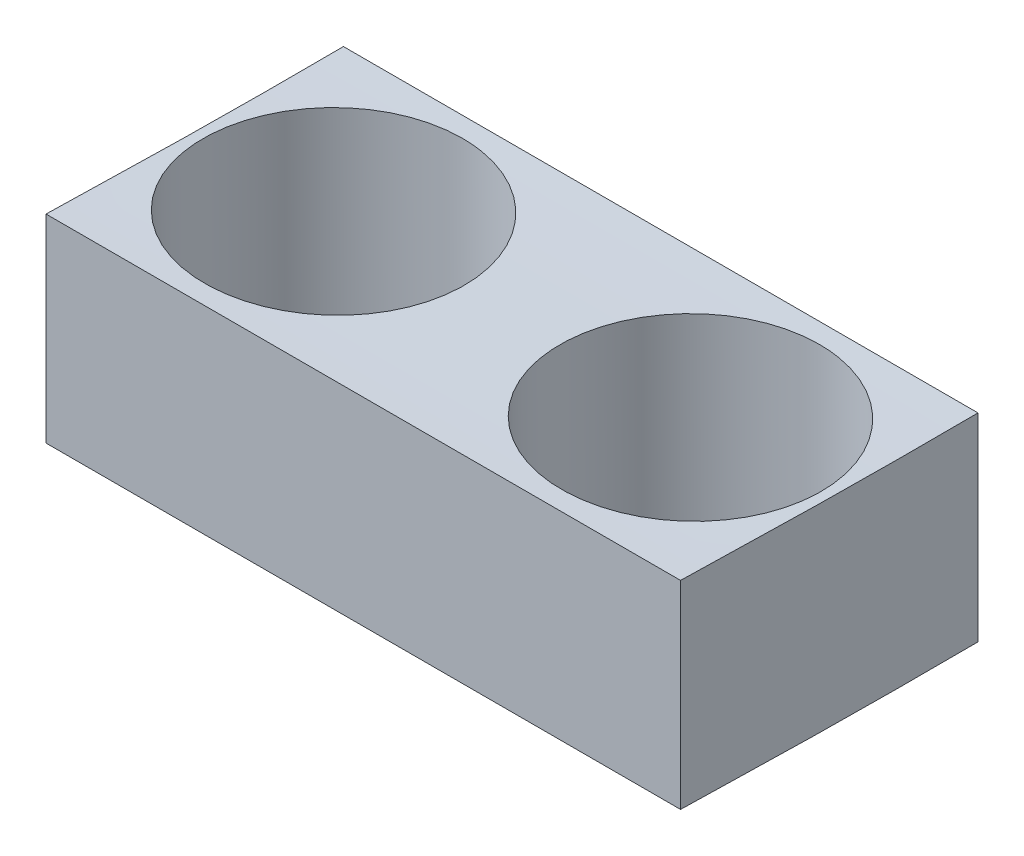
ISO-10303-21;
HEADER;
FILE_DESCRIPTION(('STEP AP214'),'2;1');
FILE_NAME('part.step','',(''),(''),'','','');
FILE_SCHEMA(('AUTOMOTIVE_DESIGN { 1 0 10303 214 1 1 1 1 }'));
ENDSEC;
DATA;
#1=APPLICATION_CONTEXT('core data for automotive mechanical design processes');
#2=APPLICATION_PROTOCOL_DEFINITION('international standard','automotive_design',2000,#1);
#3=PRODUCT_CONTEXT('',#1,'mechanical');
#4=PRODUCT('Part','Part','',(#3));
#5=PRODUCT_RELATED_PRODUCT_CATEGORY('part','',(#4));
#6=PRODUCT_DEFINITION_FORMATION('','',#4);
#7=PRODUCT_DEFINITION_CONTEXT('part definition',#1,'design');
#8=PRODUCT_DEFINITION('design','',#6,#7);
#9=PRODUCT_DEFINITION_SHAPE('','',#8);
#10=(LENGTH_UNIT() NAMED_UNIT(*) SI_UNIT(.MILLI.,.METRE.));
#11=(NAMED_UNIT(*) PLANE_ANGLE_UNIT() SI_UNIT($,.RADIAN.));
#12=(NAMED_UNIT(*) SI_UNIT($,.STERADIAN.) SOLID_ANGLE_UNIT());
#13=UNCERTAINTY_MEASURE_WITH_UNIT(LENGTH_MEASURE(1.E-05),#10,'distance_accuracy_value','');
#14=(GEOMETRIC_REPRESENTATION_CONTEXT(3) GLOBAL_UNCERTAINTY_ASSIGNED_CONTEXT((#13)) GLOBAL_UNIT_ASSIGNED_CONTEXT((#10,
#11,#12)) REPRESENTATION_CONTEXT('',''));
#15=CARTESIAN_POINT('',(0.,0.,0.));
#16=DIRECTION('',(0.,0.,1.));
#17=DIRECTION('',(1.,0.,0.));
#18=AXIS2_PLACEMENT_3D('',#15,#16,#17);
#19=CARTESIAN_POINT('',(-40.,-39.376697628539,0.));
#20=CARTESIAN_POINT('',(-40.,-37.8138326416831,-18.6089310298579));
#21=CARTESIAN_POINT('',(-40.,-41.4487875194083,-60.5220187074735));
#22=CARTESIAN_POINT('',(-40.,-41.8150395607881,-82.6293162514277));
#23=CARTESIAN_POINT('',(-40.,-29.981594576715,-94.4769548986795));
#24=CARTESIAN_POINT('',(-40.,-11.4071796829403,-72.3520517103376));
#25=CARTESIAN_POINT('',(-40.,50.0000000000028,-96.0000000000011));
#26=B_SPLINE_CURVE_WITH_KNOTS('',3,(#19,#20,#21,#22,#23,#24,#25),.UNSPECIFIED.,.F.,.F.,(4,1,1,1,
4),(0.,0.361871867439847,0.526261734758969,0.755385014590914,1.),.UNSPECIFIED.);
#27=DIRECTION('',(1.,0.,0.));
#28=VECTOR('',#27,1.);
#29=SURFACE_OF_LINEAR_EXTRUSION('',#26,#28);
#30=OFFSET_SURFACE('',#29,2.,.F.);
#31=CARTESIAN_POINT('',(-8.2,-43.4846554974634,-71.6682456572165));
#32=CARTESIAN_POINT('',(-8.27303112387663,-43.4846556502531,-71.6682406465253));
#33=CARTESIAN_POINT('',(-8.34613831165488,-43.4846864136896,-71.6620626131756));
#34=CARTESIAN_POINT('',(-8.45417123849626,-43.4847699746228,-71.6436833802276));
#35=CARTESIAN_POINT('',(-8.4899396909148,-43.4848041078006,-71.6360282026123));
#36=CARTESIAN_POINT('',(-8.56074039152526,-43.4848811254592,-71.6177274385375));
#37=CARTESIAN_POINT('',(-8.5957719614552,-43.4849240176441,-71.6070792163785));
#38=CARTESIAN_POINT('',(-8.69924031339842,-43.4850592391006,-71.5707810972745));
#39=CARTESIAN_POINT('',(-8.76619239579917,-43.4851582536088,-71.5407534923485));
#40=CARTESIAN_POINT('',(-8.89409790578115,-43.4853265089781,-71.4698700296098));
#41=CARTESIAN_POINT('',(-8.95505121898232,-43.4853957492716,-71.4290139653829));
#42=CARTESIAN_POINT('',(-9.04066005857345,-43.4854354910246,-71.3605322294756));
#43=CARTESIAN_POINT('',(-9.06824247509395,-43.4854380322336,-71.3364870738783));
#44=CARTESIAN_POINT('',(-9.12125984129126,-43.4854148245407,-71.286185573025));
#45=CARTESIAN_POINT('',(-9.1466968292553,-43.485389102824,-71.2599313749764));
#46=CARTESIAN_POINT('',(-9.21956444353279,-43.4852592764635,-71.1780679514658));
#47=CARTESIAN_POINT('',(-9.26357308119811,-43.4851025305622,-71.119340774761));
#48=CARTESIAN_POINT('',(-9.34107886669575,-43.4846034285649,-70.9953667087432));
#49=CARTESIAN_POINT('',(-9.37457682115559,-43.4842610867176,-70.930120320245));
#50=CARTESIAN_POINT('',(-9.43015086783799,-43.4833624100307,-70.7949237200832));
#51=CARTESIAN_POINT('',(-9.45222698557537,-43.482806075669,-70.7249735189279));
#52=CARTESIAN_POINT('',(-9.48432281901926,-43.4814725938492,-70.582363556741));
#53=CARTESIAN_POINT('',(-9.49434242142594,-43.480695444316,-70.5097037702531));
#54=CARTESIAN_POINT('',(-9.50204472978763,-43.4789369874492,-70.3637352808305));
#55=CARTESIAN_POINT('',(-9.49972744336393,-43.4779556802418,-70.2904265782967));
#56=CARTESIAN_POINT('',(-9.48282106159425,-43.4758278089597,-70.1452261217602));
#57=CARTESIAN_POINT('',(-9.46822954783514,-43.4746812123546,-70.0733346498541));
#58=CARTESIAN_POINT('',(-9.42718687478221,-43.4722810136944,-69.9330224565727));
#59=CARTESIAN_POINT('',(-9.40073568102471,-43.4710274113283,-69.864601745284));
#60=CARTESIAN_POINT('',(-9.33671579204778,-43.4684846033379,-69.7331542846599));
#61=CARTESIAN_POINT('',(-9.29914418772997,-43.4671953884776,-69.6701289523241));
#62=CARTESIAN_POINT('',(-9.213951685453,-43.4646606462488,-69.551280808086));
#63=CARTESIAN_POINT('',(-9.16633078607163,-43.4634151188866,-69.495457997203));
#64=CARTESIAN_POINT('',(-9.06238857222688,-43.4610470593677,-69.3925984993422));
#65=CARTESIAN_POINT('',(-9.00606701898153,-43.4599245305881,-69.345562053577));
#66=CARTESIAN_POINT('',(-8.88632222060555,-43.4578756643075,-69.2616142461664));
#67=CARTESIAN_POINT('',(-8.82289898662817,-43.4569493264984,-69.2247028686199));
#68=CARTESIAN_POINT('',(-8.69077246263277,-43.4553542578008,-69.1620656056666));
#69=CARTESIAN_POINT('',(-8.62207086392351,-43.454685444805,-69.1363361547596));
#70=CARTESIAN_POINT('',(-8.48132068497089,-43.4536494580269,-69.0967782589318));
#71=CARTESIAN_POINT('',(-8.40927211374067,-43.4532822834323,-69.0829497819645));
#72=CARTESIAN_POINT('',(-8.26390554334303,-43.4528741476542,-69.0675910489207));
#73=CARTESIAN_POINT('',(-8.19058808822901,-43.4528330499708,-69.066055646806));
#74=CARTESIAN_POINT('',(-8.04473632449364,-43.4530794501121,-69.0753132409209));
#75=CARTESIAN_POINT('',(-7.97220201492549,-43.4533669475395,-69.0861062222438));
#76=CARTESIAN_POINT('',(-7.82998629639846,-43.4542513018657,-69.1197107215228));
#77=CARTESIAN_POINT('',(-7.76030447360821,-43.4548481137171,-69.1425204894075));
#78=CARTESIAN_POINT('',(-7.62575911218361,-43.4563114033955,-69.1995085733103));
#79=CARTESIAN_POINT('',(-7.56089557900296,-43.4571778815278,-69.2336869021961));
#80=CARTESIAN_POINT('',(-7.43780935829287,-43.4591235204157,-69.3124511230809));
#81=CARTESIAN_POINT('',(-7.37958839953484,-43.4602027363392,-69.3570397152596));
#82=CARTESIAN_POINT('',(-7.27145648753467,-43.4625031851663,-69.455353504246));
#83=CARTESIAN_POINT('',(-7.22154555913485,-43.4637244184944,-69.5090787283662));
#84=CARTESIAN_POINT('',(-7.13142809183294,-43.4662312014234,-69.6241665949467));
#85=CARTESIAN_POINT('',(-7.0912257322794,-43.4675167784366,-69.6855325094079));
#86=CARTESIAN_POINT('',(-7.02169289629293,-43.4700720950948,-69.8141424669916));
#87=CARTESIAN_POINT('',(-6.99236242509711,-43.4713418347322,-69.8813865129456));
#88=CARTESIAN_POINT('',(-6.94540042443464,-43.4737915594479,-70.0198613062948));
#89=CARTESIAN_POINT('',(-6.9277715166692,-43.47497152436,-70.0910929432243));
#90=CARTESIAN_POINT('',(-6.90472413040742,-43.4771792317987,-70.2355068463306));
#91=CARTESIAN_POINT('',(-6.8993056660949,-43.4782069741485,-70.3086891147732));
#92=CARTESIAN_POINT('',(-6.90083655724749,-43.4800657691059,-70.4549197416699));
#93=CARTESIAN_POINT('',(-6.90778432918013,-43.4808968468814,-70.5279681160704));
#94=CARTESIAN_POINT('',(-6.93384168207776,-43.4823399621694,-70.671854992747));
#95=CARTESIAN_POINT('',(-6.95295126815988,-43.4829519995897,-70.7426934940932));
#96=CARTESIAN_POINT('',(-7.00281204031894,-43.4839579803342,-70.8801702568316));
#97=CARTESIAN_POINT('',(-7.03356028090579,-43.4843519787774,-70.9468095759722));
#98=CARTESIAN_POINT('',(-7.08768952288126,-43.4847969731603,-71.0421132547074));
#99=CARTESIAN_POINT('',(-7.10707139683355,-43.4849209801371,-71.0731105510409));
#100=CARTESIAN_POINT('',(-7.14839318576957,-43.4851255889827,-71.1333954673348));
#101=CARTESIAN_POINT('',(-7.17033554331159,-43.4852061489869,-71.1626814141392));
#102=CARTESIAN_POINT('',(-7.23971878531149,-43.4853903689154,-71.2475562030343));
#103=CARTESIAN_POINT('',(-7.29076996271752,-43.4854369757807,-71.3002570646243));
#104=CARTESIAN_POINT('',(-7.40100292878272,-43.4854303340653,-71.3963265721173));
#105=CARTESIAN_POINT('',(-7.46018456201403,-43.4853770873931,-71.4396953963779));
#106=CARTESIAN_POINT('',(-7.55375968909839,-43.4852646816273,-71.4968368746868));
#107=CARTESIAN_POINT('',(-7.58578573171794,-43.4852217320766,-71.5145789586019));
#108=CARTESIAN_POINT('',(-7.65118578223092,-43.4851314660106,-71.5472883616101));
#109=CARTESIAN_POINT('',(-7.68455857560411,-43.4850841533827,-71.5622581156133));
#110=CARTESIAN_POINT('',(-7.78634799483633,-43.4849450074464,-71.6028352841677));
#111=CARTESIAN_POINT('',(-7.85653979746781,-43.4848558014372,-71.6241740683759));
#112=CARTESIAN_POINT('',(-7.97263554016092,-43.4847463283771,-71.6490276501623));
#113=CARTESIAN_POINT('',(-8.01779885422297,-43.4847127554587,-71.6562242389168));
#114=CARTESIAN_POINT('',(-8.10863151761496,-43.4846672921975,-71.6658348102358));
#115=CARTESIAN_POINT('',(-8.15430086696079,-43.4846554018555,-71.6682487926502));
#116=CARTESIAN_POINT('',(-8.2,-43.4846554974634,-71.6682456572165));
#117=B_SPLINE_CURVE_WITH_KNOTS('',3,(#31,#32,#33,#34,#35,#36,#37,#38,#39,#40,#41,#42,#43,#44,
#45,#46,#47,#48,#49,#50,#51,#52,#53,#54,#55,#56,#57,#58,#59,#60,#61,#62,#63,#64,#65,#66,#67,#68,
#69,#70,#71,#72,#73,#74,#75,#76,#77,#78,#79,#80,#81,#82,#83,#84,#85,#86,#87,#88,#89,#90,#91,#92,
#93,#94,#95,#96,#97,#98,#99,#100,#101,#102,#103,#104,#105,#106,#107,#108,#109,#110,#111,#112,
#113,#114,#115,#116),.UNSPECIFIED.,.T.,.F.,(4,2,2,2,2,2,2,2,2,2,2,2,2,2,2,2,2,2,2,2,2,2,2,2,2,2,
2,2,2,2,2,2,2,2,2,2,2,2,2,2,2,2,4),(0.,0.218897818099868,0.328527456001121,0.438253938754205,
0.657281307682837,0.87631285205387,0.985973888539678,1.09552953843753,1.314559753963,
1.5335731562109,1.75258606921073,1.97160104034496,2.1906158761793,2.40967387501167,
2.62873251042021,2.84784850227327,3.06696452513645,3.28608656251963,3.50520825577489,
3.72426002792299,3.94331121021521,4.16227069009069,4.38122990521792,4.60015724090989,
4.81908482439705,5.03806925580531,5.25705434184197,5.47613352929091,5.69521282227271,
5.91434118277945,6.13346979782855,6.35257035484081,6.57167100404073,6.79071624066963,
6.90027927623439,7.00994769664631,7.22896056346426,7.44796924405161,7.55768973734911,
7.66731340240548,7.88619937382433,8.02317440127386,8.16014943301839),.UNSPECIFIED.);
#118=CARTESIAN_POINT('',(-8.2,-43.4846554974634,-71.6682456572165));
#119=VERTEX_POINT('',#118);
#120=EDGE_CURVE('E172',#119,#119,#117,.T.);
#121=ORIENTED_EDGE('',*,*,#120,.T.);
#122=EDGE_LOOP('',(#121));
#123=FACE_BOUND('',#122,.T.);
#124=DIRECTION('',(1.,0.,0.));
#125=VECTOR('',#124,1.);
#126=CARTESIAN_POINT('',(0.,-43.4834502732561,-71.8589316958776));
#127=LINE('',#126,#125);
#128=CARTESIAN_POINT('',(-6.8,-43.4834502732561,-71.8589316958776));
#129=VERTEX_POINT('',#128);
#130=CARTESIAN_POINT('',(-13.2,-43.4834502732561,-71.8589316958776));
#131=VERTEX_POINT('',#130);
#132=EDGE_CURVE('E12',#129,#131,#127,.F.);
#133=ORIENTED_EDGE('',*,*,#132,.F.);
#134=CARTESIAN_POINT('',(-6.8,-43.4471154849081,-68.8589316958776));
#135=CARTESIAN_POINT('',(-6.8,-43.4518691412671,-69.0255607476172));
#136=CARTESIAN_POINT('',(-6.8,-43.4562562444957,-69.1922007044846));
#137=CARTESIAN_POINT('',(-6.8,-43.4642114739682,-69.5254888623006));
#138=CARTESIAN_POINT('',(-6.8,-43.4677796553685,-69.6921370619374));
#139=CARTESIAN_POINT('',(-6.8,-43.4740117074276,-70.0254438197788));
#140=CARTESIAN_POINT('',(-6.8,-43.4766756148282,-70.1921023772872));
#141=CARTESIAN_POINT('',(-6.8,-43.4810050897368,-70.5254341787751));
#142=CARTESIAN_POINT('',(-6.8,-43.4826706478442,-70.6921074228781));
#143=CARTESIAN_POINT('',(-6.8,-43.4849030154317,-71.0254668183174));
#144=CARTESIAN_POINT('',(-6.8,-43.4854697905965,-71.1921529698944));
#145=CARTESIAN_POINT('',(-6.8,-43.4853944042354,-71.5255380658306));
#146=CARTESIAN_POINT('',(-6.8,-43.4847521469752,-71.6922370101577));
#147=CARTESIAN_POINT('',(-6.8,-43.4834502732561,-71.8589316958777));
#148=B_SPLINE_CURVE_WITH_KNOTS('',3,(#134,#135,#136,#137,#138,#139,#140,#141,#142,#143,#144,
#145,#146,#147),.UNSPECIFIED.,.F.,.F.,(4,2,2,2,2,2,4),(0.,0.500090794916213,1.00014789763484,
1.50018467996219,2.00022617069861,2.50028327768226,3.00037998218205),.UNSPECIFIED.);
#149=CARTESIAN_POINT('',(-6.8,-43.4471154849081,-68.8589316958776));
#150=VERTEX_POINT('',#149);
#151=EDGE_CURVE('E106',#150,#129,#148,.T.);
#152=ORIENTED_EDGE('',*,*,#151,.F.);
#153=DIRECTION('',(1.,0.,0.));
#154=VECTOR('',#153,1.);
#155=CARTESIAN_POINT('',(0.,-43.4471154849081,-68.8589316958777));
#156=LINE('',#155,#154);
#157=CARTESIAN_POINT('',(-13.2,-43.4471154849081,-68.8589316958776));
#158=VERTEX_POINT('',#157);
#159=EDGE_CURVE('E111',#150,#158,#156,.F.);
#160=ORIENTED_EDGE('',*,*,#159,.T.);
#161=CARTESIAN_POINT('',(-13.2,-43.4471154849081,-68.8589316958776));
#162=CARTESIAN_POINT('',(-13.2,-43.4518691412671,-69.0255607476172));
#163=CARTESIAN_POINT('',(-13.2,-43.4562562444957,-69.1922007044846));
#164=CARTESIAN_POINT('',(-13.2,-43.4642114739682,-69.5254888623006));
#165=CARTESIAN_POINT('',(-13.2,-43.4677796553685,-69.6921370619374));
#166=CARTESIAN_POINT('',(-13.2,-43.4740117074276,-70.0254438197788));
#167=CARTESIAN_POINT('',(-13.2,-43.4766756148282,-70.1921023772872));
#168=CARTESIAN_POINT('',(-13.2,-43.4810050897368,-70.5254341787751));
#169=CARTESIAN_POINT('',(-13.2,-43.4826706478442,-70.6921074228781));
#170=CARTESIAN_POINT('',(-13.2,-43.4849030154317,-71.0254668183174));
#171=CARTESIAN_POINT('',(-13.2,-43.4854697905965,-71.1921529698944));
#172=CARTESIAN_POINT('',(-13.2,-43.4853944042354,-71.5255380658306));
#173=CARTESIAN_POINT('',(-13.2,-43.4847521469752,-71.6922370101577));
#174=CARTESIAN_POINT('',(-13.2,-43.4834502732561,-71.8589316958777));
#175=B_SPLINE_CURVE_WITH_KNOTS('',3,(#161,#162,#163,#164,#165,#166,#167,#168,#169,#170,#171,
#172,#173,#174),.UNSPECIFIED.,.F.,.F.,(4,2,2,2,2,2,4),(0.,0.500090794916213,1.00014789763484,
1.50018467996219,2.00022617069861,2.50028327768226,3.00037998218205),.UNSPECIFIED.);
#176=EDGE_CURVE('E76',#158,#131,#175,.T.);
#177=ORIENTED_EDGE('',*,*,#176,.T.);
#178=EDGE_LOOP('',(#133,#152,#160,#177));
#179=FACE_BOUND('',#178,.T.);
#180=CARTESIAN_POINT('',(-11.8,-43.4846554974634,-71.6682456572165));
#181=CARTESIAN_POINT('',(-11.8730311238766,-43.4846556502531,-71.6682406465253));
#182=CARTESIAN_POINT('',(-11.9461383116549,-43.4846864136896,-71.6620626131756));
#183=CARTESIAN_POINT('',(-12.0541712384963,-43.4847699746228,-71.6436833802276));
#184=CARTESIAN_POINT('',(-12.0899396909148,-43.4848041078006,-71.6360282026123));
#185=CARTESIAN_POINT('',(-12.1607403915253,-43.4848811254592,-71.6177274385376));
#186=CARTESIAN_POINT('',(-12.1957719614552,-43.4849240176441,-71.6070792163785));
#187=CARTESIAN_POINT('',(-12.2992403133984,-43.4850592391006,-71.5707810972745));
#188=CARTESIAN_POINT('',(-12.3661923957992,-43.4851582536088,-71.5407534923485));
#189=CARTESIAN_POINT('',(-12.4940979057812,-43.4853265089781,-71.4698700296099));
#190=CARTESIAN_POINT('',(-12.5550512189823,-43.4853957492716,-71.429013965383));
#191=CARTESIAN_POINT('',(-12.6406600585734,-43.4854354910246,-71.3605322294756));
#192=CARTESIAN_POINT('',(-12.6682424750939,-43.4854380322336,-71.3364870738783));
#193=CARTESIAN_POINT('',(-12.7212598412913,-43.4854148245407,-71.286185573025));
#194=CARTESIAN_POINT('',(-12.7466968292553,-43.485389102824,-71.2599313749764));
#195=CARTESIAN_POINT('',(-12.8195644435328,-43.4852592764635,-71.1780679514658));
#196=CARTESIAN_POINT('',(-12.8635730811981,-43.4851025305622,-71.119340774761));
#197=CARTESIAN_POINT('',(-12.9410788666958,-43.4846034285649,-70.9953667087432));
#198=CARTESIAN_POINT('',(-12.9745768211556,-43.4842610867176,-70.930120320245));
#199=CARTESIAN_POINT('',(-13.030150867838,-43.4833624100307,-70.7949237200832));
#200=CARTESIAN_POINT('',(-13.0522269855754,-43.482806075669,-70.7249735189279));
#201=CARTESIAN_POINT('',(-13.0843228190193,-43.4814725938492,-70.582363556741));
#202=CARTESIAN_POINT('',(-13.0943424214259,-43.480695444316,-70.5097037702531));
#203=CARTESIAN_POINT('',(-13.1020447297876,-43.4789369874492,-70.3637352808305));
#204=CARTESIAN_POINT('',(-13.0997274433639,-43.4779556802418,-70.2904265782967));
#205=CARTESIAN_POINT('',(-13.0828210615942,-43.4758278089597,-70.1452261217602));
#206=CARTESIAN_POINT('',(-13.0682295478351,-43.4746812123546,-70.0733346498541));
#207=CARTESIAN_POINT('',(-13.0271868747822,-43.4722810136944,-69.9330224565727));
#208=CARTESIAN_POINT('',(-13.0007356810247,-43.4710274113283,-69.864601745284));
#209=CARTESIAN_POINT('',(-12.9367157920478,-43.4684846033379,-69.7331542846599));
#210=CARTESIAN_POINT('',(-12.89914418773,-43.4671953884776,-69.6701289523241));
#211=CARTESIAN_POINT('',(-12.813951685453,-43.4646606462488,-69.551280808086));
#212=CARTESIAN_POINT('',(-12.7663307860716,-43.4634151188866,-69.495457997203));
#213=CARTESIAN_POINT('',(-12.6623885722269,-43.4610470593677,-69.3925984993422));
#214=CARTESIAN_POINT('',(-12.6060670189815,-43.4599245305881,-69.3455620535769));
#215=CARTESIAN_POINT('',(-12.4863222206056,-43.4578756643075,-69.2616142461664));
#216=CARTESIAN_POINT('',(-12.4228989866282,-43.4569493264984,-69.2247028686199));
#217=CARTESIAN_POINT('',(-12.2907724626328,-43.4553542578008,-69.1620656056666));
#218=CARTESIAN_POINT('',(-12.2220708639235,-43.454685444805,-69.1363361547596));
#219=CARTESIAN_POINT('',(-12.0813206849709,-43.4536494580269,-69.0967782589318));
#220=CARTESIAN_POINT('',(-12.0092721137407,-43.4532822834323,-69.0829497819645));
#221=CARTESIAN_POINT('',(-11.863905543343,-43.4528741476542,-69.0675910489207));
#222=CARTESIAN_POINT('',(-11.790588088229,-43.4528330499707,-69.066055646806));
#223=CARTESIAN_POINT('',(-11.6447363244936,-43.4530794501121,-69.0753132409209));
#224=CARTESIAN_POINT('',(-11.5722020149255,-43.4533669475395,-69.0861062222438));
#225=CARTESIAN_POINT('',(-11.4299862963985,-43.4542513018657,-69.1197107215228));
#226=CARTESIAN_POINT('',(-11.3603044736082,-43.4548481137171,-69.1425204894075));
#227=CARTESIAN_POINT('',(-11.2257591121836,-43.4563114033955,-69.1995085733103));
#228=CARTESIAN_POINT('',(-11.160895579003,-43.4571778815278,-69.2336869021961));
#229=CARTESIAN_POINT('',(-11.0378093582929,-43.4591235204157,-69.3124511230809));
#230=CARTESIAN_POINT('',(-10.9795883995348,-43.4602027363392,-69.3570397152596));
#231=CARTESIAN_POINT('',(-10.8714564875347,-43.4625031851663,-69.455353504246));
#232=CARTESIAN_POINT('',(-10.8215455591348,-43.4637244184944,-69.5090787283662));
#233=CARTESIAN_POINT('',(-10.7314280918329,-43.4662312014234,-69.6241665949468));
#234=CARTESIAN_POINT('',(-10.6912257322794,-43.4675167784366,-69.6855325094079));
#235=CARTESIAN_POINT('',(-10.6216928962929,-43.4700720950948,-69.8141424669916));
#236=CARTESIAN_POINT('',(-10.5923624250971,-43.4713418347322,-69.8813865129456));
#237=CARTESIAN_POINT('',(-10.5454004244346,-43.4737915594479,-70.0198613062948));
#238=CARTESIAN_POINT('',(-10.5277715166692,-43.47497152436,-70.0910929432243));
#239=CARTESIAN_POINT('',(-10.5047241304074,-43.4771792317987,-70.2355068463306));
#240=CARTESIAN_POINT('',(-10.4993056660949,-43.4782069741485,-70.3086891147732));
#241=CARTESIAN_POINT('',(-10.5008365572475,-43.4800657691059,-70.4549197416699));
#242=CARTESIAN_POINT('',(-10.5077843291801,-43.4808968468814,-70.5279681160704));
#243=CARTESIAN_POINT('',(-10.5338416820778,-43.4823399621694,-70.671854992747));
#244=CARTESIAN_POINT('',(-10.5529512681599,-43.4829519995897,-70.7426934940932));
#245=CARTESIAN_POINT('',(-10.6028120403189,-43.4839579803342,-70.8801702568316));
#246=CARTESIAN_POINT('',(-10.6335602809058,-43.4843519787774,-70.9468095759722));
#247=CARTESIAN_POINT('',(-10.6876895228813,-43.4847969731603,-71.0421132547074));
#248=CARTESIAN_POINT('',(-10.7070713968335,-43.4849209801371,-71.0731105510409));
#249=CARTESIAN_POINT('',(-10.7483931857696,-43.4851255889827,-71.1333954673348));
#250=CARTESIAN_POINT('',(-10.7703355433116,-43.4852061489869,-71.1626814141392));
#251=CARTESIAN_POINT('',(-10.8397187853115,-43.4853903689154,-71.2475562030343));
#252=CARTESIAN_POINT('',(-10.8907699627175,-43.4854369757807,-71.3002570646243));
#253=CARTESIAN_POINT('',(-11.0010029287827,-43.4854303340653,-71.3963265721173));
#254=CARTESIAN_POINT('',(-11.060184562014,-43.4853770873931,-71.4396953963779));
#255=CARTESIAN_POINT('',(-11.1537596890984,-43.4852646816273,-71.4968368746868));
#256=CARTESIAN_POINT('',(-11.1857857317179,-43.4852217320766,-71.5145789586019));
#257=CARTESIAN_POINT('',(-11.2511857822309,-43.4851314660106,-71.5472883616101));
#258=CARTESIAN_POINT('',(-11.2845585756041,-43.4850841533827,-71.5622581156133));
#259=CARTESIAN_POINT('',(-11.3863479948363,-43.4849450074464,-71.6028352841677));
#260=CARTESIAN_POINT('',(-11.4565397974678,-43.4848558014372,-71.6241740683759));
#261=CARTESIAN_POINT('',(-11.5726355401609,-43.4847463283771,-71.6490276501623));
#262=CARTESIAN_POINT('',(-11.617798854223,-43.4847127554587,-71.6562242389168));
#263=CARTESIAN_POINT('',(-11.708631517615,-43.4846672921975,-71.6658348102358));
#264=CARTESIAN_POINT('',(-11.7543008669608,-43.4846554018555,-71.6682487926502));
#265=CARTESIAN_POINT('',(-11.8,-43.4846554974634,-71.6682456572165));
#266=B_SPLINE_CURVE_WITH_KNOTS('',3,(#180,#181,#182,#183,#184,#185,#186,#187,#188,#189,#190,
#191,#192,#193,#194,#195,#196,#197,#198,#199,#200,#201,#202,#203,#204,#205,#206,#207,#208,#209,
#210,#211,#212,#213,#214,#215,#216,#217,#218,#219,#220,#221,#222,#223,#224,#225,#226,#227,#228,
#229,#230,#231,#232,#233,#234,#235,#236,#237,#238,#239,#240,#241,#242,#243,#244,#245,#246,#247,
#248,#249,#250,#251,#252,#253,#254,#255,#256,#257,#258,#259,#260,#261,#262,#263,#264,#265),
.UNSPECIFIED.,.T.,.F.,(4,2,2,2,2,2,2,2,2,2,2,2,2,2,2,2,2,2,2,2,2,2,2,2,2,2,2,2,2,2,2,2,2,2,2,2,
2,2,2,2,2,2,4),(0.,0.218897818099866,0.32852745600112,0.438253938754205,0.657281307682838,
0.876312852053861,0.985973888539668,1.09552953843753,1.31455975396301,1.53357315621091,
1.75258606921074,1.97160104034497,2.19061587617934,2.40967387501168,2.62873251042022,
2.84784850227328,3.06696452513645,3.28608656251963,3.50520825577489,3.72426002792299,
3.94331121021522,4.16227069009069,4.38122990521793,4.6001572409099,4.81908482439706,
5.03806925580532,5.25705434184199,5.47613352929094,5.69521282227272,5.91434118277947,
6.13346979782857,6.35257035484082,6.57167100404074,6.79071624066964,6.90027927623441,
7.00994769664633,7.22896056346427,7.44796924405162,7.55768973734911,7.66731340240549,
7.88619937382434,8.02317440127387,8.16014943301841),.UNSPECIFIED.);
#267=CARTESIAN_POINT('',(-11.8,-43.4846554974634,-71.6682456572165));
#268=VERTEX_POINT('',#267);
#269=EDGE_CURVE('E120',#268,#268,#266,.T.);
#270=ORIENTED_EDGE('',*,*,#269,.T.);
#271=EDGE_LOOP('',(#270));
#272=FACE_BOUND('',#271,.T.);
#273=ADVANCED_FACE('F63',(#123,#179,#272),#30,.T.);
#274=CARTESIAN_POINT('',(-40.,-39.376697628539,0.));
#275=CARTESIAN_POINT('',(-40.,-37.8138326416831,-18.6089310298579));
#276=CARTESIAN_POINT('',(-40.,-41.4487875194083,-60.5220187074735));
#277=CARTESIAN_POINT('',(-40.,-41.8150395607881,-82.6293162514277));
#278=CARTESIAN_POINT('',(-40.,-29.981594576715,-94.4769548986795));
#279=CARTESIAN_POINT('',(-40.,-11.4071796829403,-72.3520517103376));
#280=CARTESIAN_POINT('',(-40.,50.0000000000028,-96.0000000000011));
#281=B_SPLINE_CURVE_WITH_KNOTS('',3,(#274,#275,#276,#277,#278,#279,#280),.UNSPECIFIED.,.F.,.F.,
(4,1,1,1,4),(0.,0.361871867439847,0.526261734758969,0.755385014590914,1.),.UNSPECIFIED.);
#282=DIRECTION('',(1.,0.,0.));
#283=VECTOR('',#282,1.);
#284=SURFACE_OF_LINEAR_EXTRUSION('',#281,#283);
#285=CARTESIAN_POINT('',(-6.8,-39.376697628539,0.));
#286=CARTESIAN_POINT('',(-6.8,-37.813832641683,-18.6089310298579));
#287=CARTESIAN_POINT('',(-6.8,-41.4487875194083,-60.5220187074735));
#288=CARTESIAN_POINT('',(-6.8,-41.8150395607881,-82.6293162514277));
#289=CARTESIAN_POINT('',(-6.8,-29.981594576715,-94.4769548986795));
#290=CARTESIAN_POINT('',(-6.80000000000001,-11.4071796829403,-72.3520517103376));
#291=CARTESIAN_POINT('',(-6.80000000000001,50.0000000000028,-96.0000000000011));
#292=B_SPLINE_CURVE_WITH_KNOTS('',3,(#285,#286,#287,#288,#289,#290,#291),.UNSPECIFIED.,.F.,.F.,
(4,1,1,1,4),(0.,0.361871867439847,0.526261734758969,0.755385014590914,1.),.UNSPECIFIED.);
#293=CARTESIAN_POINT('',(-6.8,-41.4462867715539,-68.8589316958776));
#294=VERTEX_POINT('',#293);
#295=CARTESIAN_POINT('',(-6.8,-41.4833871406451,-71.8589316958809));
#296=VERTEX_POINT('',#295);
#297=EDGE_CURVE('E258',#294,#296,#292,.T.);
#298=ORIENTED_EDGE('',*,*,#297,.T.);
#299=DIRECTION('',(1.,0.,0.));
#300=VECTOR('',#299,1.);
#301=CARTESIAN_POINT('',(0.,-41.4833871406452,-71.8589316958776));
#302=LINE('',#301,#300);
#303=CARTESIAN_POINT('',(-13.2,-41.4833871406451,-71.8589316958776));
#304=VERTEX_POINT('',#303);
#305=EDGE_CURVE('E112',#296,#304,#302,.F.);
#306=ORIENTED_EDGE('',*,*,#305,.T.);
#307=CARTESIAN_POINT('',(-13.2,-39.376697628539,0.));
#308=CARTESIAN_POINT('',(-13.2,-37.813832641683,-18.6089310298579));
#309=CARTESIAN_POINT('',(-13.2,-41.4487875194083,-60.5220187074735));
#310=CARTESIAN_POINT('',(-13.2,-41.8150395607881,-82.6293162514277));
#311=CARTESIAN_POINT('',(-13.2,-29.981594576715,-94.4769548986795));
#312=CARTESIAN_POINT('',(-13.2,-11.4071796829403,-72.3520517103376));
#313=CARTESIAN_POINT('',(-13.2,50.0000000000028,-96.0000000000011));
#314=B_SPLINE_CURVE_WITH_KNOTS('',3,(#307,#308,#309,#310,#311,#312,#313),.UNSPECIFIED.,.F.,.F.,
(4,1,1,1,4),(0.,0.361871867439847,0.526261734758969,0.755385014590914,1.),.UNSPECIFIED.);
#315=CARTESIAN_POINT('',(-13.2,-41.4462867713483,-68.8589316958776));
#316=VERTEX_POINT('',#315);
#317=EDGE_CURVE('E269',#316,#304,#314,.T.);
#318=ORIENTED_EDGE('',*,*,#317,.F.);
#319=DIRECTION('',(1.,0.,0.));
#320=VECTOR('',#319,1.);
#321=CARTESIAN_POINT('',(0.,-41.4462867713483,-68.8589316958776));
#322=LINE('',#321,#320);
#323=EDGE_CURVE('E265',#294,#316,#322,.F.);
#324=ORIENTED_EDGE('',*,*,#323,.F.);
#325=EDGE_LOOP('',(#298,#306,#318,#324));
#326=FACE_BOUND('',#325,.T.);
#327=CARTESIAN_POINT('',(-8.2,-41.4846761620815,-71.659135610244));
#328=CARTESIAN_POINT('',(-8.27303111702453,-41.4846763189983,-71.6591305996257));
#329=CARTESIAN_POINT('',(-8.34613829274004,-41.4847071654013,-71.6529525682609));
#330=CARTESIAN_POINT('',(-8.45417120117878,-41.48479072124,-71.6345733407601));
#331=CARTESIAN_POINT('',(-8.48993964562774,-41.4848248310533,-71.6269181659981));
#332=CARTESIAN_POINT('',(-8.56074033096096,-41.4849016495106,-71.608617408195));
#333=CARTESIAN_POINT('',(-8.59577189357368,-41.484944365724,-71.597969189417));
#334=CARTESIAN_POINT('',(-8.69924023024312,-41.4850786458621,-71.56167107845));
#335=CARTESIAN_POINT('',(-8.76619230524554,-41.4851764825374,-71.5316434773308));
#336=CARTESIAN_POINT('',(-8.89409779840827,-41.4853399913135,-71.4607600165611));
#337=CARTESIAN_POINT('',(-8.95505110230427,-41.4854056628018,-71.4199039507051));
#338=CARTESIAN_POINT('',(-9.04065989475154,-41.4854372469568,-71.3514222334745));
#339=CARTESIAN_POINT('',(-9.06824227856298,-41.4854365985422,-71.3273771004695));
#340=CARTESIAN_POINT('',(-9.12125958047984,-41.4854059324788,-71.2770756511015));
#341=CARTESIAN_POINT('',(-9.14669653686564,-41.4853759430551,-71.2508214819336));
#342=CARTESIAN_POINT('',(-9.21956405549928,-41.4852314826777,-71.1689581605365));
#343=CARTESIAN_POINT('',(-9.26357263072514,-41.4850625377714,-71.1102310704962));
#344=CARTESIAN_POINT('',(-9.34107818489359,-41.4845335191213,-70.986257441415));
#345=CARTESIAN_POINT('',(-9.37457600257449,-41.4841734606342,-70.9210114231202));
#346=CARTESIAN_POINT('',(-9.43014989749463,-41.4832338022213,-70.7858157016624));
#347=CARTESIAN_POINT('',(-9.45222600022882,-41.4826542027855,-70.715866008999));
#348=CARTESIAN_POINT('',(-9.48432202107558,-41.4812692450518,-70.5732570898646));
#349=CARTESIAN_POINT('',(-9.49434180680305,-41.4804638842749,-70.5005978336501));
#350=CARTESIAN_POINT('',(-9.5020447141579,-41.4786452014395,-70.3546304938179));
#351=CARTESIAN_POINT('',(-9.49972784256472,-41.4776318794952,-70.2813224105569));
#352=CARTESIAN_POINT('',(-9.48282248505516,-41.4754376788568,-70.1361224077059));
#353=CARTESIAN_POINT('',(-9.46823144887948,-41.4742567653838,-70.0642307855978));
#354=CARTESIAN_POINT('',(-9.42718976904793,-41.4717873681154,-69.9239182492536));
#355=CARTESIAN_POINT('',(-9.40073909005375,-41.4704988839993,-69.8554973453601));
#356=CARTESIAN_POINT('',(-9.33671988567494,-41.4678874705972,-69.7240486780579));
#357=CARTESIAN_POINT('',(-9.29914833198081,-41.4665645320185,-69.6610223896837));
#358=CARTESIAN_POINT('',(-9.21395564441116,-41.4639651597696,-69.5421723503184));
#359=CARTESIAN_POINT('',(-9.16633450907313,-41.4626887261061,-69.4863486003754));
#360=CARTESIAN_POINT('',(-9.06239157357237,-41.4602631007398,-69.3834873878295));
#361=CARTESIAN_POINT('',(-9.00606954906353,-41.4591139123192,-69.3364501518497));
#362=CARTESIAN_POINT('',(-8.8863234790442,-41.4570171377899,-69.2525009182945));
#363=CARTESIAN_POINT('',(-8.8228994452216,-41.4560695513494,-69.2155889040564));
#364=CARTESIAN_POINT('',(-8.69077197465119,-41.4544382944487,-69.1529510943706));
#365=CARTESIAN_POINT('',(-8.62207030494344,-41.4537545361123,-69.1272215738821));
#366=CARTESIAN_POINT('',(-8.48131986873958,-41.4526955292241,-69.0876635855813));
#367=CARTESIAN_POINT('',(-8.40927111158001,-41.4523202798119,-69.0738350845738));
#368=CARTESIAN_POINT('',(-8.26390526211444,-41.4519031793556,-69.0584765236765));
#369=CARTESIAN_POINT('',(-8.19058873412092,-41.4518611836162,-69.0569411262442));
#370=CARTESIAN_POINT('',(-8.04473882146711,-41.4521129848502,-69.0661984505833));
#371=CARTESIAN_POINT('',(-7.97220543582365,-41.4524067814021,-69.0769911568761));
#372=CARTESIAN_POINT('',(-7.82999190841382,-41.4533106882244,-69.1105947124023));
#373=CARTESIAN_POINT('',(-7.76031133842433,-41.4539207508325,-69.1334037507383));
#374=CARTESIAN_POINT('',(-7.62576834958834,-41.4554169787595,-69.1903899120028));
#375=CARTESIAN_POINT('',(-7.56090593638141,-41.4563031444017,-69.2245670482372));
#376=CARTESIAN_POINT('',(-7.43782113140055,-41.4582938104917,-69.3033287709375));
#377=CARTESIAN_POINT('',(-7.37960052904496,-41.4593983695605,-69.3479161522916));
#378=CARTESIAN_POINT('',(-7.27146906350767,-41.461754062086,-69.446227249145));
#379=CARTESIAN_POINT('',(-7.22155822598227,-41.4630051959952,-69.4999509928516));
#380=CARTESIAN_POINT('',(-7.13143979342608,-41.4655750161025,-69.6150366653406));
#381=CARTESIAN_POINT('',(-7.09123653937736,-41.4668937322032,-69.6764019927205));
#382=CARTESIAN_POINT('',(-7.02170179130191,-41.4695169450644,-69.8050108970869));
#383=CARTESIAN_POINT('',(-6.9923703033723,-41.4708214418167,-69.87225447737));
#384=CARTESIAN_POINT('',(-6.94540587558203,-41.4733405904822,-70.0107293346264));
#385=CARTESIAN_POINT('',(-6.92777568978529,-41.4745552211843,-70.0819615461046));
#386=CARTESIAN_POINT('',(-6.90472595271624,-41.4768303971201,-70.2263769128211));
#387=CARTESIAN_POINT('',(-6.8993064155041,-41.4778909421763,-70.2995600703058));
#388=CARTESIAN_POINT('',(-6.90083545919237,-41.4798118767195,-70.445792555938));
#389=CARTESIAN_POINT('',(-6.90778242150748,-41.4806722923838,-70.5188419003469));
#390=CARTESIAN_POINT('',(-6.93383848308391,-41.4821693658918,-70.6627309307584));
#391=CARTESIAN_POINT('',(-6.95294758654975,-41.4828060236583,-70.7335706159971));
#392=CARTESIAN_POINT('',(-7.00280748027209,-41.4838557691077,-70.8710489955356));
#393=CARTESIAN_POINT('',(-7.03355518196518,-41.4842689160338,-70.9376887989004));
#394=CARTESIAN_POINT('',(-7.08768373144148,-41.4847384266539,-71.0329932922317));
#395=CARTESIAN_POINT('',(-7.10706539356613,-41.4848699056177,-71.0639908745334));
#396=CARTESIAN_POINT('',(-7.14838679912281,-41.4850881250216,-71.1242763830289));
#397=CARTESIAN_POINT('',(-7.17032898513722,-41.4851748223078,-71.1535626360963));
#398=CARTESIAN_POINT('',(-7.23971139208013,-41.4853755332911,-71.2384378907823));
#399=CARTESIAN_POINT('',(-7.29076188794413,-41.4854305992969,-71.2911389921198));
#400=CARTESIAN_POINT('',(-7.40099352344572,-41.4854367988228,-71.387209128547));
#401=CARTESIAN_POINT('',(-7.46017450774973,-41.4853879343281,-71.4305783418824));
#402=CARTESIAN_POINT('',(-7.55374872538112,-41.4852800487267,-71.4877205215605));
#403=CARTESIAN_POINT('',(-7.58577448757187,-41.4852382638245,-71.5054628641199));
#404=CARTESIAN_POINT('',(-7.65117399642662,-41.4851498103741,-71.538172814134));
#405=CARTESIAN_POINT('',(-7.68454652854335,-41.4851031461682,-71.5531428564925));
#406=CARTESIAN_POINT('',(-7.78633520363365,-41.4849654211617,-71.593720936538));
#407=CARTESIAN_POINT('',(-7.85652655433393,-41.4848764671944,-71.6150603864142));
#408=CARTESIAN_POINT('',(-7.9726240777104,-41.4847671063034,-71.639915651832));
#409=CARTESIAN_POINT('',(-8.01778963773934,-41.4847335049445,-71.6471129708616));
#410=CARTESIAN_POINT('',(-8.10862687027169,-41.4846879837354,-71.6567245179205));
#411=CARTESIAN_POINT('',(-8.15429854279182,-41.4846760638859,-71.6591387457918));
#412=CARTESIAN_POINT('',(-8.2,-41.4846761620815,-71.659135610244));
#413=B_SPLINE_CURVE_WITH_KNOTS('',3,(#327,#328,#329,#330,#331,#332,#333,#334,#335,#336,#337,
#338,#339,#340,#341,#342,#343,#344,#345,#346,#347,#348,#349,#350,#351,#352,#353,#354,#355,#356,
#357,#358,#359,#360,#361,#362,#363,#364,#365,#366,#367,#368,#369,#370,#371,#372,#373,#374,#375,
#376,#377,#378,#379,#380,#381,#382,#383,#384,#385,#386,#387,#388,#389,#390,#391,#392,#393,#394,
#395,#396,#397,#398,#399,#400,#401,#402,#403,#404,#405,#406,#407,#408,#409,#410,#411,#412),
.UNSPECIFIED.,.T.,.F.,(4,2,2,2,2,2,2,2,2,2,2,2,2,2,2,2,2,2,2,2,2,2,2,2,2,2,2,2,2,2,2,2,2,2,2,2,
2,2,2,2,2,2,4),(0.,0.218897789065864,0.328527401239299,0.438253859635584,0.657281198236166,
0.876312708052241,0.985973625289008,1.09552915635608,1.31455912459202,1.53357161020867,
1.75258360695513,1.97159800855383,2.19061228979644,2.40967208788078,2.62873253870466,
2.84785269653229,3.06697288624848,3.28609872676275,3.50522420666327,3.72427663683283,
3.94332845600242,4.1622851599036,4.38124158888925,4.60016502991525,4.81908872718328,
5.0380712676659,5.25705448424173,5.47613544388907,5.69521652640132,5.91434915441997,
6.13348203476269,6.35258623607757,6.57169051313782,6.79073668667533,6.90030018830689,
7.00996907458898,7.22898105748579,7.44798885672376,7.55770898720992,7.66733228896913,
7.88621756174893,8.02319954993728,8.16018154264866),.UNSPECIFIED.);
#414=CARTESIAN_POINT('',(-8.2,-41.4846761620815,-71.659135610244));
#415=VERTEX_POINT('',#414);
#416=EDGE_CURVE('E167',#415,#415,#413,.T.);
#417=ORIENTED_EDGE('',*,*,#416,.F.);
#418=EDGE_LOOP('',(#417));
#419=FACE_BOUND('',#418,.T.);
#420=CARTESIAN_POINT('',(-11.8,-41.4846761620815,-71.659135610244));
#421=CARTESIAN_POINT('',(-11.8730311170245,-41.4846763189983,-71.6591305996258));
#422=CARTESIAN_POINT('',(-11.94613829274,-41.4847071654013,-71.6529525682609));
#423=CARTESIAN_POINT('',(-12.0541712011788,-41.4847907212399,-71.6345733407601));
#424=CARTESIAN_POINT('',(-12.0899396456277,-41.4848248310533,-71.6269181659981));
#425=CARTESIAN_POINT('',(-12.160740330961,-41.4849016495106,-71.608617408195));
#426=CARTESIAN_POINT('',(-12.1957718935737,-41.484944365724,-71.597969189417));
#427=CARTESIAN_POINT('',(-12.2992402302431,-41.4850786458621,-71.56167107845));
#428=CARTESIAN_POINT('',(-12.3661923052455,-41.4851764825374,-71.5316434773308));
#429=CARTESIAN_POINT('',(-12.4940977984083,-41.4853399913136,-71.460760016561));
#430=CARTESIAN_POINT('',(-12.5550511023043,-41.4854056628018,-71.4199039507051));
#431=CARTESIAN_POINT('',(-12.6406598947515,-41.4854372469568,-71.3514222334745));
#432=CARTESIAN_POINT('',(-12.668242278563,-41.4854365985422,-71.3273771004695));
#433=CARTESIAN_POINT('',(-12.7212595804799,-41.4854059324788,-71.2770756511014));
#434=CARTESIAN_POINT('',(-12.7466965368656,-41.4853759430551,-71.2508214819336));
#435=CARTESIAN_POINT('',(-12.8195640554993,-41.4852314826777,-71.1689581605365));
#436=CARTESIAN_POINT('',(-12.8635726307251,-41.4850625377714,-71.1102310704961));
#437=CARTESIAN_POINT('',(-12.9410781848936,-41.4845335191213,-70.9862574414149));
#438=CARTESIAN_POINT('',(-12.9745760025745,-41.4841734606342,-70.9210114231202));
#439=CARTESIAN_POINT('',(-13.0301498974946,-41.4832338022213,-70.7858157016624));
#440=CARTESIAN_POINT('',(-13.0522260002288,-41.4826542027855,-70.715866008999));
#441=CARTESIAN_POINT('',(-13.0843220210756,-41.4812692450518,-70.5732570898646));
#442=CARTESIAN_POINT('',(-13.0943418068031,-41.4804638842749,-70.5005978336501));
#443=CARTESIAN_POINT('',(-13.1020447141579,-41.4786452014395,-70.3546304938179));
#444=CARTESIAN_POINT('',(-13.0997278425647,-41.4776318794952,-70.2813224105569));
#445=CARTESIAN_POINT('',(-13.0828224850552,-41.4754376788568,-70.1361224077059));
#446=CARTESIAN_POINT('',(-13.0682314488795,-41.4742567653838,-70.0642307855978));
#447=CARTESIAN_POINT('',(-13.0271897690479,-41.4717873681154,-69.9239182492536));
#448=CARTESIAN_POINT('',(-13.0007390900538,-41.4704988839993,-69.8554973453601));
#449=CARTESIAN_POINT('',(-12.9367198856749,-41.4678874705972,-69.7240486780579));
#450=CARTESIAN_POINT('',(-12.8991483319808,-41.4665645320185,-69.6610223896837));
#451=CARTESIAN_POINT('',(-12.8139556444112,-41.4639651597696,-69.5421723503184));
#452=CARTESIAN_POINT('',(-12.7663345090731,-41.4626887261061,-69.4863486003754));
#453=CARTESIAN_POINT('',(-12.6623915735724,-41.4602631007398,-69.3834873878295));
#454=CARTESIAN_POINT('',(-12.6060695490635,-41.4591139123192,-69.3364501518496));
#455=CARTESIAN_POINT('',(-12.4863234790442,-41.4570171377899,-69.2525009182945));
#456=CARTESIAN_POINT('',(-12.4228994452216,-41.4560695513494,-69.2155889040564));
#457=CARTESIAN_POINT('',(-12.2907719746512,-41.4544382944487,-69.1529510943706));
#458=CARTESIAN_POINT('',(-12.2220703049434,-41.4537545361123,-69.1272215738821));
#459=CARTESIAN_POINT('',(-12.0813198687396,-41.4526955292241,-69.0876635855813));
#460=CARTESIAN_POINT('',(-12.00927111158,-41.4523202798119,-69.0738350845738));
#461=CARTESIAN_POINT('',(-11.8639052621144,-41.4519031793556,-69.0584765236765));
#462=CARTESIAN_POINT('',(-11.7905887341209,-41.4518611836162,-69.0569411262442));
#463=CARTESIAN_POINT('',(-11.6447388214671,-41.4521129848502,-69.0661984505833));
#464=CARTESIAN_POINT('',(-11.5722054358236,-41.4524067814021,-69.0769911568761));
#465=CARTESIAN_POINT('',(-11.4299919084138,-41.4533106882244,-69.1105947124023));
#466=CARTESIAN_POINT('',(-11.3603113384243,-41.4539207508325,-69.1334037507383));
#467=CARTESIAN_POINT('',(-11.2257683495883,-41.4554169787595,-69.1903899120028));
#468=CARTESIAN_POINT('',(-11.1609059363814,-41.4563031444017,-69.2245670482372));
#469=CARTESIAN_POINT('',(-11.0378211314005,-41.4582938104917,-69.3033287709375));
#470=CARTESIAN_POINT('',(-10.9796005290449,-41.4593983695605,-69.3479161522916));
#471=CARTESIAN_POINT('',(-10.8714690635077,-41.461754062086,-69.4462272491449));
#472=CARTESIAN_POINT('',(-10.8215582259823,-41.4630051959952,-69.4999509928516));
#473=CARTESIAN_POINT('',(-10.7314397934261,-41.4655750161025,-69.6150366653406));
#474=CARTESIAN_POINT('',(-10.6912365393773,-41.4668937322032,-69.6764019927205));
#475=CARTESIAN_POINT('',(-10.6217017913019,-41.4695169450644,-69.8050108970869));
#476=CARTESIAN_POINT('',(-10.5923703033723,-41.4708214418167,-69.87225447737));
#477=CARTESIAN_POINT('',(-10.545405875582,-41.4733405904822,-70.0107293346264));
#478=CARTESIAN_POINT('',(-10.5277756897853,-41.4745552211843,-70.0819615461046));
#479=CARTESIAN_POINT('',(-10.5047259527162,-41.4768303971201,-70.2263769128211));
#480=CARTESIAN_POINT('',(-10.4993064155041,-41.4778909421763,-70.2995600703058));
#481=CARTESIAN_POINT('',(-10.5008354591924,-41.4798118767195,-70.445792555938));
#482=CARTESIAN_POINT('',(-10.5077824215075,-41.4806722923837,-70.5188419003469));
#483=CARTESIAN_POINT('',(-10.5338384830839,-41.4821693658918,-70.6627309307584));
#484=CARTESIAN_POINT('',(-10.5529475865498,-41.4828060236583,-70.7335706159971));
#485=CARTESIAN_POINT('',(-10.6028074802721,-41.4838557691077,-70.8710489955356));
#486=CARTESIAN_POINT('',(-10.6335551819652,-41.4842689160338,-70.9376887989004));
#487=CARTESIAN_POINT('',(-10.6876837314415,-41.4847384266539,-71.0329932922317));
#488=CARTESIAN_POINT('',(-10.7070653935661,-41.4848699056177,-71.0639908745334));
#489=CARTESIAN_POINT('',(-10.7483867991228,-41.4850881250216,-71.1242763830289));
#490=CARTESIAN_POINT('',(-10.7703289851372,-41.4851748223078,-71.1535626360963));
#491=CARTESIAN_POINT('',(-10.8397113920802,-41.4853755332911,-71.2384378907823));
#492=CARTESIAN_POINT('',(-10.8907618879441,-41.4854305992969,-71.2911389921199));
#493=CARTESIAN_POINT('',(-11.0009935234457,-41.4854367988228,-71.387209128547));
#494=CARTESIAN_POINT('',(-11.0601745077498,-41.4853879343281,-71.4305783418824));
#495=CARTESIAN_POINT('',(-11.1537487253812,-41.4852800487267,-71.4877205215605));
#496=CARTESIAN_POINT('',(-11.1857744875719,-41.4852382638245,-71.5054628641199));
#497=CARTESIAN_POINT('',(-11.2511739964266,-41.4851498103741,-71.538172814134));
#498=CARTESIAN_POINT('',(-11.2845465285434,-41.4851031461682,-71.5531428564925));
#499=CARTESIAN_POINT('',(-11.3863352036337,-41.4849654211617,-71.593720936538));
#500=CARTESIAN_POINT('',(-11.456526554334,-41.4848764671944,-71.6150603864142));
#501=CARTESIAN_POINT('',(-11.5726240777104,-41.4847671063034,-71.639915651832));
#502=CARTESIAN_POINT('',(-11.6177896377393,-41.4847335049445,-71.6471129708616));
#503=CARTESIAN_POINT('',(-11.7086268702717,-41.4846879837354,-71.6567245179205));
#504=CARTESIAN_POINT('',(-11.7542985427918,-41.4846760638859,-71.6591387457918));
#505=CARTESIAN_POINT('',(-11.8,-41.4846761620815,-71.659135610244));
#506=B_SPLINE_CURVE_WITH_KNOTS('',3,(#420,#421,#422,#423,#424,#425,#426,#427,#428,#429,#430,
#431,#432,#433,#434,#435,#436,#437,#438,#439,#440,#441,#442,#443,#444,#445,#446,#447,#448,#449,
#450,#451,#452,#453,#454,#455,#456,#457,#458,#459,#460,#461,#462,#463,#464,#465,#466,#467,#468,
#469,#470,#471,#472,#473,#474,#475,#476,#477,#478,#479,#480,#481,#482,#483,#484,#485,#486,#487,
#488,#489,#490,#491,#492,#493,#494,#495,#496,#497,#498,#499,#500,#501,#502,#503,#504,#505),
.UNSPECIFIED.,.T.,.F.,(4,2,2,2,2,2,2,2,2,2,2,2,2,2,2,2,2,2,2,2,2,2,2,2,2,2,2,2,2,2,2,2,2,2,2,2,
2,2,2,2,2,2,4),(0.,0.218897789065868,0.328527401239308,0.438253859635591,0.657281198236172,
0.876312708052259,0.985973625289033,1.0955291563561,1.31455912459205,1.53357161020871,
1.75258360695515,1.97159800855385,2.19061228979643,2.40967208788077,2.62873253870466,
2.8478526965323,3.0669728862485,3.28609872676278,3.5052242066633,3.72427663683285,
3.94332845600243,4.16228515990362,4.38124158888927,4.60016502991527,4.8190887271833,
5.03807126766591,5.25705448424177,5.47613544388911,5.69521652640135,5.91434915441998,
6.13348203476271,6.3525862360776,6.57169051313784,6.79073668667536,6.90030018830692,
7.009969074589,7.22898105748582,7.4479888567238,7.55770898720996,7.66733228896917,
7.88621756174897,8.0231995499373,8.16018154264868),.UNSPECIFIED.);
#507=CARTESIAN_POINT('',(-11.8,-41.4846761620815,-71.659135610244));
#508=VERTEX_POINT('',#507);
#509=EDGE_CURVE('E67',#508,#508,#506,.T.);
#510=ORIENTED_EDGE('',*,*,#509,.F.);
#511=EDGE_LOOP('',(#510));
#512=FACE_BOUND('',#511,.T.);
#513=ADVANCED_FACE('F161',(#326,#419,#512),#284,.F.);
#514=CARTESIAN_POINT('',(0.,-58.3249066608493,-71.8589316958776));
#515=DIRECTION('',(0.,0.,1.));
#516=DIRECTION('',(1.,0.,0.));
#517=AXIS2_PLACEMENT_3D('',#514,#515,#516);
#518=PLANE('',#517);
#519=DIRECTION('',(0.,1.,0.));
#520=VECTOR('',#519,1.);
#521=CARTESIAN_POINT('',(-6.8,-58.3249066608493,-71.8589316958776));
#522=LINE('',#521,#520);
#523=EDGE_CURVE('E84',#129,#296,#522,.T.);
#524=ORIENTED_EDGE('',*,*,#523,.F.);
#525=ORIENTED_EDGE('',*,*,#132,.T.);
#526=DIRECTION('',(0.,1.,0.));
#527=VECTOR('',#526,1.);
#528=CARTESIAN_POINT('',(-13.2,-58.3249066608493,-71.8589316958776));
#529=LINE('',#528,#527);
#530=EDGE_CURVE('E189',#131,#304,#529,.T.);
#531=ORIENTED_EDGE('',*,*,#530,.T.);
#532=ORIENTED_EDGE('',*,*,#305,.F.);
#533=EDGE_LOOP('',(#524,#525,#531,#532));
#534=FACE_BOUND('',#533,.T.);
#535=ADVANCED_FACE('F115',(#534),#518,.F.);
#536=CARTESIAN_POINT('',(-13.2,-58.3249066608493,0.));
#537=DIRECTION('',(-1.,0.,0.));
#538=DIRECTION('',(0.,0.,1.));
#539=AXIS2_PLACEMENT_3D('',#536,#537,#538);
#540=PLANE('',#539);
#541=ORIENTED_EDGE('',*,*,#317,.T.);
#542=ORIENTED_EDGE('',*,*,#530,.F.);
#543=ORIENTED_EDGE('',*,*,#176,.F.);
#544=DIRECTION('',(0.,1.,0.));
#545=VECTOR('',#544,1.);
#546=CARTESIAN_POINT('',(-13.2,-58.3249066608493,-68.8589316958776));
#547=LINE('',#546,#545);
#548=EDGE_CURVE('E259',#158,#316,#547,.T.);
#549=ORIENTED_EDGE('',*,*,#548,.T.);
#550=EDGE_LOOP('',(#541,#542,#543,#549));
#551=FACE_BOUND('',#550,.T.);
#552=ADVANCED_FACE('F134',(#551),#540,.T.);
#553=CARTESIAN_POINT('',(0.,-58.3249066608493,-68.8589316958776));
#554=DIRECTION('',(0.,0.,1.));
#555=DIRECTION('',(1.,0.,0.));
#556=AXIS2_PLACEMENT_3D('',#553,#554,#555);
#557=PLANE('',#556);
#558=ORIENTED_EDGE('',*,*,#323,.T.);
#559=ORIENTED_EDGE('',*,*,#548,.F.);
#560=ORIENTED_EDGE('',*,*,#159,.F.);
#561=DIRECTION('',(0.,1.,0.));
#562=VECTOR('',#561,1.);
#563=CARTESIAN_POINT('',(-6.8,-58.3249066608493,-68.8589316958776));
#564=LINE('',#563,#562);
#565=EDGE_CURVE('E89',#150,#294,#564,.T.);
#566=ORIENTED_EDGE('',*,*,#565,.T.);
#567=EDGE_LOOP('',(#558,#559,#560,#566));
#568=FACE_BOUND('',#567,.T.);
#569=ADVANCED_FACE('F139',(#568),#557,.T.);
#570=CARTESIAN_POINT('',(-6.8,-58.3249066608493,0.));
#571=DIRECTION('',(-1.,0.,0.));
#572=DIRECTION('',(0.,0.,1.));
#573=AXIS2_PLACEMENT_3D('',#570,#571,#572);
#574=PLANE('',#573);
#575=ORIENTED_EDGE('',*,*,#565,.F.);
#576=ORIENTED_EDGE('',*,*,#151,.T.);
#577=ORIENTED_EDGE('',*,*,#523,.T.);
#578=ORIENTED_EDGE('',*,*,#297,.F.);
#579=EDGE_LOOP('',(#575,#576,#577,#578));
#580=FACE_BOUND('',#579,.T.);
#581=ADVANCED_FACE('F107',(#580),#574,.F.);
#582=CARTESIAN_POINT('',(-8.2,-41.4394542364049,-70.3589161346181));
#583=DIRECTION('',(0.,-0.999989625827577,-0.00455502329556929));
#584=DIRECTION('',(0.,0.00455502329556929,-0.999989625827577));
#585=AXIS2_PLACEMENT_3D('',#582,#583,#584);
#586=CYLINDRICAL_SURFACE('',#585,1.3);
#587=ORIENTED_EDGE('',*,*,#120,.F.);
#588=EDGE_LOOP('',(#587));
#589=FACE_BOUND('',#588,.T.);
#590=ORIENTED_EDGE('',*,*,#416,.T.);
#591=EDGE_LOOP('',(#590));
#592=FACE_BOUND('',#591,.T.);
#593=ADVANCED_FACE('F140',(#589,#592),#586,.F.);
#594=CARTESIAN_POINT('',(-11.8,-41.4394542364049,-70.3589161346181));
#595=DIRECTION('',(0.,-0.999989625827577,-0.00455502329556929));
#596=DIRECTION('',(0.,0.00455502329556929,-0.999989625827577));
#597=AXIS2_PLACEMENT_3D('',#594,#595,#596);
#598=CYLINDRICAL_SURFACE('',#597,1.3);
#599=ORIENTED_EDGE('',*,*,#269,.F.);
#600=EDGE_LOOP('',(#599));
#601=FACE_BOUND('',#600,.T.);
#602=ORIENTED_EDGE('',*,*,#509,.T.);
#603=EDGE_LOOP('',(#602));
#604=FACE_BOUND('',#603,.T.);
#605=ADVANCED_FACE('F191',(#601,#604),#598,.F.);
#606=CLOSED_SHELL('',(#273,#513,#535,#552,#569,#581,#593,#605));
#607=MANIFOLD_SOLID_BREP('B2',#606);
#608=ADVANCED_BREP_SHAPE_REPRESENTATION('',(#18,#607),#14);
#609=SHAPE_DEFINITION_REPRESENTATION(#9,#608);
ENDSEC;
END-ISO-10303-21;
